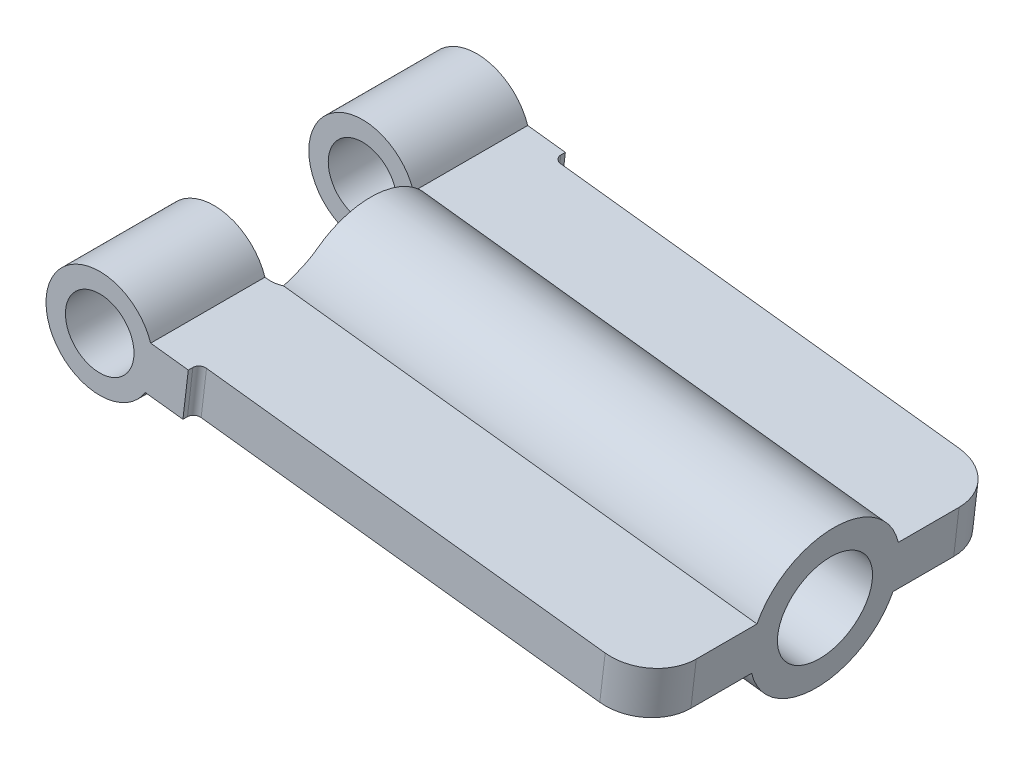
ISO-10303-21;
HEADER;
FILE_DESCRIPTION(('STEP AP214'),'2;1');
FILE_NAME('part.step','',(''),(''),'','','');
FILE_SCHEMA(('AUTOMOTIVE_DESIGN { 1 0 10303 214 1 1 1 1 }'));
ENDSEC;
DATA;
#1=APPLICATION_CONTEXT('core data for automotive mechanical design processes');
#2=APPLICATION_PROTOCOL_DEFINITION('international standard','automotive_design',2000,#1);
#3=PRODUCT_CONTEXT('',#1,'mechanical');
#4=PRODUCT('Part','Part','',(#3));
#5=PRODUCT_RELATED_PRODUCT_CATEGORY('part','',(#4));
#6=PRODUCT_DEFINITION_FORMATION('','',#4);
#7=PRODUCT_DEFINITION_CONTEXT('part definition',#1,'design');
#8=PRODUCT_DEFINITION('design','',#6,#7);
#9=PRODUCT_DEFINITION_SHAPE('','',#8);
#10=(LENGTH_UNIT() NAMED_UNIT(*) SI_UNIT(.MILLI.,.METRE.));
#11=(NAMED_UNIT(*) PLANE_ANGLE_UNIT() SI_UNIT($,.RADIAN.));
#12=(NAMED_UNIT(*) SI_UNIT($,.STERADIAN.) SOLID_ANGLE_UNIT());
#13=UNCERTAINTY_MEASURE_WITH_UNIT(LENGTH_MEASURE(1.E-05),#10,'distance_accuracy_value','');
#14=(GEOMETRIC_REPRESENTATION_CONTEXT(3) GLOBAL_UNCERTAINTY_ASSIGNED_CONTEXT((#13)) GLOBAL_UNIT_ASSIGNED_CONTEXT((#10,
#11,#12)) REPRESENTATION_CONTEXT('',''));
#15=CARTESIAN_POINT('',(0.,0.,0.));
#16=DIRECTION('',(0.,0.,1.));
#17=DIRECTION('',(1.,0.,0.));
#18=AXIS2_PLACEMENT_3D('',#15,#16,#17);
#19=CARTESIAN_POINT('',(23.4858565630687,-2.78155379221129,0.));
#20=DIRECTION('',(0.993059474125525,-0.117613268169611,0.));
#21=DIRECTION('',(0.117613268169611,0.993059474125525,0.));
#22=AXIS2_PLACEMENT_3D('',#19,#20,#21);
#23=CYLINDRICAL_SURFACE('',#22,3.25);
#24=CARTESIAN_POINT('',(2.95161572761441,-2.7111740254914,2.25));
#25=CARTESIAN_POINT('',(2.95608626582767,-2.67332087750269,2.28973842390793));
#26=CARTESIAN_POINT('',(2.95834630297442,-2.63422824473732,2.32844830436368));
#27=CARTESIAN_POINT('',(2.95901822293239,-2.55398116454721,2.40356244787179));
#28=CARTESIAN_POINT('',(2.95743719842487,-2.51283065454717,2.43997083331723));
#29=CARTESIAN_POINT('',(2.94793377351575,-2.3884554142713,2.54411581247918));
#30=CARTESIAN_POINT('',(2.93538661532174,-2.30269811205184,2.60844208561217));
#31=CARTESIAN_POINT('',(2.90487472472898,-2.14560740365681,2.71448607889645));
#32=CARTESIAN_POINT('',(2.88866302684828,-2.07515418458704,2.75808726110204));
#33=CARTESIAN_POINT('',(2.8518297221004,-1.93197490144439,2.83945958726462));
#34=CARTESIAN_POINT('',(2.83120387601062,-1.8592467102904,2.87722506631085));
#35=CARTESIAN_POINT('',(2.78578779507672,-1.70964869318461,2.94819146320348));
#36=CARTESIAN_POINT('',(2.76088043498594,-1.63272194879341,2.98119512696013));
#37=CARTESIAN_POINT('',(2.70830746896609,-1.47770864708105,3.04118583915157));
#38=CARTESIAN_POINT('',(2.68064880606524,-1.39962541217537,3.06818750298834));
#39=CARTESIAN_POINT('',(2.65199320383998,-1.32107856784959,3.09232921921325));
#40=B_SPLINE_CURVE_WITH_KNOTS('',3,(#24,#25,#26,#27,#28,#29,#30,#31,#32,#33,#34,#35,#36,#37,#38,
#39),.UNSPECIFIED.,.F.,.F.,(4,2,2,2,2,2,2,4),(0.,0.165012537301252,0.32972060370622,
0.652255157365791,0.905198504533902,1.1583858702371,1.42012481859849,1.68121925188461),.UNSPECIFIED.);
#41=CARTESIAN_POINT('',(2.95161572761441,-2.7111740254914,2.25));
#42=VERTEX_POINT('',#41);
#43=CARTESIAN_POINT('',(2.65199320383998,-1.32107856784959,3.09232921921325));
#44=VERTEX_POINT('',#43);
#45=EDGE_CURVE('E343',#42,#44,#40,.T.);
#46=ORIENTED_EDGE('',*,*,#45,.F.);
#47=CARTESIAN_POINT('',(3.22744329090795,-0.382243121551234,0.));
#48=DIRECTION('',(0.993059474125525,-0.11761326816961,0.));
#49=DIRECTION('',(0.11761326816961,0.993059474125525,0.));
#50=AXIS2_PLACEMENT_3D('',#47,#48,#49);
#51=CIRCLE('',#50,3.25);
#52=CARTESIAN_POINT('',(2.95161572761441,-2.7111740254914,-2.25));
#53=VERTEX_POINT('',#52);
#54=EDGE_CURVE('E372',#42,#53,#51,.T.);
#55=ORIENTED_EDGE('',*,*,#54,.T.);
#56=CARTESIAN_POINT('',(2.65199320383997,-1.32107856784959,-3.09232921921325));
#57=CARTESIAN_POINT('',(2.68029427051749,-1.39865106755448,-3.06848716434356));
#58=CARTESIAN_POINT('',(2.70762134575508,-1.47577020353553,-3.04185588107446));
#59=CARTESIAN_POINT('',(2.75960524426523,-1.62887894399866,-2.98275993400808));
#60=CARTESIAN_POINT('',(2.78425575058856,-1.70486552623473,-2.95028193139521));
#61=CARTESIAN_POINT('',(2.82929073441251,-1.85270974568055,-2.88048586094778));
#62=CARTESIAN_POINT('',(2.84978684806708,-1.92462159756298,-2.84335687468868));
#63=CARTESIAN_POINT('',(2.88650666877768,-2.06624807849748,-2.76340008307072));
#64=CARTESIAN_POINT('',(2.90273410581265,-2.13596457863861,-2.72057730255835));
#65=CARTESIAN_POINT('',(2.93405367834937,-2.29424394094619,-2.61462953125852));
#66=CARTESIAN_POINT('',(2.94717587420765,-2.38182103500025,-2.54935970081785));
#67=CARTESIAN_POINT('',(2.9572460818653,-2.50879621949657,-2.44349486058805));
#68=CARTESIAN_POINT('',(2.95896605628222,-2.55080581651721,-2.40644804664452));
#69=CARTESIAN_POINT('',(2.95843329091296,-2.63270012690286,-2.32996082627924));
#70=CARTESIAN_POINT('',(2.95617288236011,-2.67258058562205,-2.2905159410354));
#71=CARTESIAN_POINT('',(2.95161572761442,-2.7111740254914,-2.25));
#72=B_SPLINE_CURVE_WITH_KNOTS('',3,(#56,#57,#58,#59,#60,#61,#62,#63,#64,#65,#66,#67,#68,#69,#70,
#71),.UNSPECIFIED.,.F.,.F.,(4,2,2,2,2,2,2,4),(0.,0.257854135384343,0.516304176346524,
0.76644864904969,1.01637381339577,1.3450727474232,1.51298087382052,1.68121285283602),.UNSPECIFIED.);
#73=CARTESIAN_POINT('',(2.65199320383998,-1.32107856784959,-3.09232921921325));
#74=VERTEX_POINT('',#73);
#75=EDGE_CURVE('E310',#74,#53,#72,.T.);
#76=ORIENTED_EDGE('',*,*,#75,.F.);
#77=DIRECTION('',(0.993059474125525,-0.117613268169611,0.));
#78=VECTOR('',#77,1.);
#79=CARTESIAN_POINT('',(23.3682432948991,-3.77461326633681,-3.09232921921325));
#80=LINE('',#79,#78);
#81=CARTESIAN_POINT('',(23.368243294899,-3.77461326633681,-3.09232921921325));
#82=VERTEX_POINT('',#81);
#83=EDGE_CURVE('E215',#82,#74,#80,.F.);
#84=ORIENTED_EDGE('',*,*,#83,.F.);
#85=CARTESIAN_POINT('',(23.4858565630687,-2.78155379221129,0.));
#86=DIRECTION('',(0.993059474125525,-0.117613268169611,0.));
#87=DIRECTION('',(0.117613268169611,0.993059474125525,0.));
#88=AXIS2_PLACEMENT_3D('',#85,#86,#87);
#89=CIRCLE('',#88,3.25);
#90=CARTESIAN_POINT('',(23.368243294899,-3.77461326633681,3.09232921921325));
#91=VERTEX_POINT('',#90);
#92=EDGE_CURVE('E230',#91,#82,#89,.T.);
#93=ORIENTED_EDGE('',*,*,#92,.F.);
#94=DIRECTION('',(0.993059474125525,-0.117613268169611,0.));
#95=VECTOR('',#94,1.);
#96=CARTESIAN_POINT('',(23.3682432948991,-3.77461326633681,3.09232921921325));
#97=LINE('',#96,#95);
#98=EDGE_CURVE('E219',#44,#91,#97,.T.);
#99=ORIENTED_EDGE('',*,*,#98,.F.);
#100=EDGE_LOOP('',(#46,#55,#76,#84,#93,#99));
#101=FACE_BOUND('',#100,.T.);
#102=ADVANCED_FACE('F17',(#101),#23,.T.);
#103=CARTESIAN_POINT('',(0.,0.,8.25));
#104=DIRECTION('',(0.,0.,-1.));
#105=DIRECTION('',(-1.,0.,0.));
#106=AXIS2_PLACEMENT_3D('',#103,#104,#105);
#107=CYLINDRICAL_SURFACE('',#106,2.35);
#108=DIRECTION('',(0.,0.,-1.));
#109=VECTOR('',#108,1.);
#110=CARTESIAN_POINT('',(2.22947045944888,0.742941094868762,8.25));
#111=LINE('',#110,#109);
#112=CARTESIAN_POINT('',(2.22947045944888,0.742941094868762,3.25));
#113=VERTEX_POINT('',#112);
#114=CARTESIAN_POINT('',(2.22947045944888,0.742941094868762,8.25));
#115=VERTEX_POINT('',#114);
#116=EDGE_CURVE('E204',#113,#115,#111,.F.);
#117=ORIENTED_EDGE('',*,*,#116,.F.);
#118=CARTESIAN_POINT('',(0.,0.,3.25));
#119=DIRECTION('',(0.,0.,1.));
#120=DIRECTION('',(1.,0.,0.));
#121=AXIS2_PLACEMENT_3D('',#118,#119,#120);
#122=CIRCLE('',#121,2.35);
#123=CARTESIAN_POINT('',(1.99424392310966,-1.24317785338229,3.25));
#124=VERTEX_POINT('',#123);
#125=EDGE_CURVE('E340',#113,#124,#122,.T.);
#126=ORIENTED_EDGE('',*,*,#125,.T.);
#127=DIRECTION('',(0.,0.,-1.));
#128=VECTOR('',#127,1.);
#129=CARTESIAN_POINT('',(1.99424392310966,-1.24317785338229,8.25));
#130=LINE('',#129,#128);
#131=CARTESIAN_POINT('',(1.99424392310966,-1.24317785338229,8.25));
#132=VERTEX_POINT('',#131);
#133=EDGE_CURVE('E216',#132,#124,#130,.T.);
#134=ORIENTED_EDGE('',*,*,#133,.F.);
#135=CARTESIAN_POINT('',(0.,0.,8.25));
#136=DIRECTION('',(0.,0.,1.));
#137=DIRECTION('',(1.,0.,0.));
#138=AXIS2_PLACEMENT_3D('',#135,#136,#137);
#139=CIRCLE('',#138,2.35);
#140=EDGE_CURVE('E223',#115,#132,#139,.T.);
#141=ORIENTED_EDGE('',*,*,#140,.F.);
#142=EDGE_LOOP('',(#117,#126,#134,#141));
#143=FACE_BOUND('',#142,.T.);
#144=ADVANCED_FACE('F418',(#143),#107,.T.);
#145=CARTESIAN_POINT('',(23.8680996846199,0.445889498696669,0.));
#146=DIRECTION('',(-0.993059474125525,0.117613268169611,0.));
#147=DIRECTION('',(-0.117613268169611,-0.993059474125525,0.));
#148=AXIS2_PLACEMENT_3D('',#145,#146,#147);
#149=PLANE('',#148);
#150=CARTESIAN_POINT('',(23.4858565630687,-2.78155379221129,0.));
#151=DIRECTION('',(0.993059474125525,-0.11761326816961,0.));
#152=DIRECTION('',(0.11761326816961,0.993059474125525,0.));
#153=AXIS2_PLACEMENT_3D('',#150,#151,#152);
#154=CIRCLE('',#153,2.067);
#155=CARTESIAN_POINT('',(23.7289631883752,-0.728899859193828,0.));
#156=VERTEX_POINT('',#155);
#157=EDGE_CURVE('E280',#156,#156,#154,.T.);
#158=ORIENTED_EDGE('',*,*,#157,.F.);
#159=EDGE_LOOP('',(#158));
#160=FACE_BOUND('',#159,.T.);
#161=DIRECTION('',(0.,0.,-1.));
#162=VECTOR('',#161,1.);
#163=CARTESIAN_POINT('',(23.368243294899,-3.77461326633681,8.25));
#164=LINE('',#163,#162);
#165=CARTESIAN_POINT('',(23.368243294899,-3.77461326633681,-5.75));
#166=VERTEX_POINT('',#165);
#167=EDGE_CURVE('E193',#82,#166,#164,.T.);
#168=ORIENTED_EDGE('',*,*,#167,.T.);
#169=DIRECTION('',(-0.11761326816961,-0.993059474125525,0.));
#170=VECTOR('',#169,1.);
#171=CARTESIAN_POINT('',(24.5737792936376,6.40424634344981,-5.75));
#172=LINE('',#171,#170);
#173=CARTESIAN_POINT('',(23.6034698312383,-1.78849431808576,-5.75));
#174=VERTEX_POINT('',#173);
#175=EDGE_CURVE('E32',#174,#166,#172,.T.);
#176=ORIENTED_EDGE('',*,*,#175,.F.);
#177=DIRECTION('',(0.,0.,-1.));
#178=VECTOR('',#177,1.);
#179=CARTESIAN_POINT('',(23.6034698312383,-1.78849431808576,8.25));
#180=LINE('',#179,#178);
#181=CARTESIAN_POINT('',(23.6034698312383,-1.78849431808576,-3.09232921921325));
#182=VERTEX_POINT('',#181);
#183=EDGE_CURVE('E194',#182,#174,#180,.T.);
#184=ORIENTED_EDGE('',*,*,#183,.F.);
#185=CARTESIAN_POINT('',(23.6034698312383,-1.78849431808576,3.09232921921325));
#186=VERTEX_POINT('',#185);
#187=EDGE_CURVE('E192',#182,#186,#89,.T.);
#188=ORIENTED_EDGE('',*,*,#187,.T.);
#189=CARTESIAN_POINT('',(23.6034698312383,-1.78849431808576,5.75));
#190=VERTEX_POINT('',#189);
#191=EDGE_CURVE('E182',#190,#186,#180,.T.);
#192=ORIENTED_EDGE('',*,*,#191,.F.);
#193=DIRECTION('',(-0.11761326816961,-0.993059474125525,0.));
#194=VECTOR('',#193,1.);
#195=CARTESIAN_POINT('',(24.5737792936376,6.40424634344981,5.75));
#196=LINE('',#195,#194);
#197=CARTESIAN_POINT('',(23.368243294899,-3.77461326633681,5.75));
#198=VERTEX_POINT('',#197);
#199=EDGE_CURVE('E164',#190,#198,#196,.T.);
#200=ORIENTED_EDGE('',*,*,#199,.T.);
#201=EDGE_CURVE('E196',#198,#91,#164,.T.);
#202=ORIENTED_EDGE('',*,*,#201,.T.);
#203=ORIENTED_EDGE('',*,*,#92,.T.);
#204=EDGE_LOOP('',(#168,#176,#184,#188,#192,#200,#202,#203));
#205=FACE_BOUND('',#204,.T.);
#206=ADVANCED_FACE('F190',(#160,#205),#149,.F.);
#207=CARTESIAN_POINT('',(0.,0.,8.25));
#208=DIRECTION('',(0.,0.,-1.));
#209=DIRECTION('',(-1.,0.,0.));
#210=AXIS2_PLACEMENT_3D('',#207,#208,#209);
#211=CYLINDRICAL_SURFACE('',#210,1.5);
#212=CARTESIAN_POINT('',(0.,0.,3.25));
#213=DIRECTION('',(0.,0.,1.));
#214=DIRECTION('',(1.,0.,0.));
#215=AXIS2_PLACEMENT_3D('',#212,#213,#214);
#216=CIRCLE('',#215,1.5);
#217=CARTESIAN_POINT('',(1.5,0.,3.25));
#218=VERTEX_POINT('',#217);
#219=EDGE_CURVE('E334',#218,#218,#216,.T.);
#220=ORIENTED_EDGE('',*,*,#219,.F.);
#221=EDGE_LOOP('',(#220));
#222=FACE_BOUND('',#221,.T.);
#223=CARTESIAN_POINT('',(0.,0.,8.25));
#224=DIRECTION('',(0.,0.,1.));
#225=DIRECTION('',(1.,0.,0.));
#226=AXIS2_PLACEMENT_3D('',#223,#224,#225);
#227=CIRCLE('',#226,1.5);
#228=CARTESIAN_POINT('',(1.5,0.,8.25));
#229=VERTEX_POINT('',#228);
#230=EDGE_CURVE('E226',#229,#229,#227,.T.);
#231=ORIENTED_EDGE('',*,*,#230,.T.);
#232=EDGE_LOOP('',(#231));
#233=FACE_BOUND('',#232,.T.);
#234=ADVANCED_FACE('F470',(#222,#233),#211,.F.);
#235=CARTESIAN_POINT('',(23.6034698312383,-1.78849431808576,8.25));
#236=DIRECTION('',(-0.11761326816961,-0.993059474125524,0.));
#237=DIRECTION('',(0.993059474125525,-0.11761326816961,0.));
#238=AXIS2_PLACEMENT_3D('',#235,#236,#237);
#239=PLANE('',#238);
#240=CARTESIAN_POINT('',(2.35199708495204,0.7284296207439,-2.25));
#241=DIRECTION('',(-0.11761326816961,-0.993059474125524,0.));
#242=DIRECTION('',(0.993059474125525,-0.11761326816961,0.));
#243=AXIS2_PLACEMENT_3D('',#240,#241,#242);
#244=CIRCLE('',#243,1.);
#245=CARTESIAN_POINT('',(2.8872197401792,0.665040380401457,-3.09232921921325));
#246=VERTEX_POINT('',#245);
#247=CARTESIAN_POINT('',(2.35199708495204,0.728429620743901,-3.25));
#248=VERTEX_POINT('',#247);
#249=EDGE_CURVE('E295',#246,#248,#244,.F.);
#250=ORIENTED_EDGE('',*,*,#249,.F.);
#251=DIRECTION('',(0.993059474125525,-0.117613268169611,0.));
#252=VECTOR('',#251,1.);
#253=CARTESIAN_POINT('',(23.6034698312383,-1.78849431808576,-3.09232921921325));
#254=LINE('',#253,#252);
#255=EDGE_CURVE('E210',#246,#182,#254,.T.);
#256=ORIENTED_EDGE('',*,*,#255,.T.);
#257=ORIENTED_EDGE('',*,*,#183,.T.);
#258=CARTESIAN_POINT('',(21.6173508829872,-1.55326778174654,-5.75000000000001));
#259=DIRECTION('',(-0.11761326816961,-0.993059474125524,0.));
#260=DIRECTION('',(0.993059474125525,-0.11761326816961,0.));
#261=AXIS2_PLACEMENT_3D('',#258,#259,#260);
#262=CIRCLE('',#261,1.99999999999999);
#263=CARTESIAN_POINT('',(21.6173508829872,-1.55326778174654,-7.75));
#264=VERTEX_POINT('',#263);
#265=EDGE_CURVE('E331',#174,#264,#262,.F.);
#266=ORIENTED_EDGE('',*,*,#265,.T.);
#267=DIRECTION('',(-0.993059474125525,0.11761326816961,0.));
#268=VECTOR('',#267,1.);
#269=CARTESIAN_POINT('',(23.6034698312383,-1.78849431808576,-7.75));
#270=LINE('',#269,#268);
#271=CARTESIAN_POINT('',(4.17426121997237,0.512609273652667,-7.75));
#272=VERTEX_POINT('',#271);
#273=EDGE_CURVE('E328',#264,#272,#270,.T.);
#274=ORIENTED_EDGE('',*,*,#273,.T.);
#275=CARTESIAN_POINT('',(4.17426121997238,0.512609273652665,-8.05));
#276=DIRECTION('',(-0.11761326816961,-0.993059474125524,0.));
#277=DIRECTION('',(0.993059474125525,-0.11761326816961,0.));
#278=AXIS2_PLACEMENT_3D('',#275,#276,#277);
#279=CIRCLE('',#278,0.3);
#280=CARTESIAN_POINT('',(3.87634337773472,0.547893254103548,-8.05));
#281=VERTEX_POINT('',#280);
#282=EDGE_CURVE('E326',#281,#272,#279,.F.);
#283=ORIENTED_EDGE('',*,*,#282,.F.);
#284=DIRECTION('',(0.,0.,-1.));
#285=VECTOR('',#284,1.);
#286=CARTESIAN_POINT('',(3.87634337773472,0.547893254103549,8.25));
#287=LINE('',#286,#285);
#288=CARTESIAN_POINT('',(3.87634337773472,0.54789325410355,-8.25));
#289=VERTEX_POINT('',#288);
#290=EDGE_CURVE('E323',#281,#289,#287,.T.);
#291=ORIENTED_EDGE('',*,*,#290,.T.);
#292=DIRECTION('',(-0.993059474125525,0.11761326816961,0.));
#293=VECTOR('',#292,1.);
#294=CARTESIAN_POINT('',(23.6034698312383,-1.78849431808576,-8.25));
#295=LINE('',#294,#293);
#296=CARTESIAN_POINT('',(2.22947045944888,0.742941094868762,-8.25));
#297=VERTEX_POINT('',#296);
#298=EDGE_CURVE('E201',#289,#297,#295,.T.);
#299=ORIENTED_EDGE('',*,*,#298,.T.);
#300=CARTESIAN_POINT('',(2.22947045944888,0.742941094868762,-3.25));
#301=VERTEX_POINT('',#300);
#302=EDGE_CURVE('E208',#297,#301,#111,.F.);
#303=ORIENTED_EDGE('',*,*,#302,.T.);
#304=DIRECTION('',(0.993059474125525,-0.11761326816961,0.));
#305=VECTOR('',#304,1.);
#306=CARTESIAN_POINT('',(23.6034698312383,-1.78849431808576,-3.25));
#307=LINE('',#306,#305);
#308=EDGE_CURVE('E319',#301,#248,#307,.T.);
#309=ORIENTED_EDGE('',*,*,#308,.T.);
#310=EDGE_LOOP('',(#250,#256,#257,#266,#274,#283,#291,#299,#303,#309));
#311=FACE_BOUND('',#310,.T.);
#312=ADVANCED_FACE('F465',(#311),#239,.F.);
#313=CARTESIAN_POINT('',(1.66989378525633,-1.20476335683082,8.25));
#314=DIRECTION('',(0.11761326816961,0.993059474125524,0.));
#315=DIRECTION('',(-0.993059474125525,0.11761326816961,0.));
#316=AXIS2_PLACEMENT_3D('',#313,#314,#315);
#317=PLANE('',#316);
#318=CARTESIAN_POINT('',(2.11677054861282,-1.25768932750715,-2.25));
#319=DIRECTION('',(0.11761326816961,0.993059474125524,0.));
#320=DIRECTION('',(-0.993059474125525,0.11761326816961,0.));
#321=AXIS2_PLACEMENT_3D('',#318,#319,#320);
#322=CIRCLE('',#321,1.);
#323=CARTESIAN_POINT('',(2.11677054861282,-1.25768932750715,-3.25));
#324=VERTEX_POINT('',#323);
#325=EDGE_CURVE('E11',#324,#74,#322,.F.);
#326=ORIENTED_EDGE('',*,*,#325,.F.);
#327=DIRECTION('',(-0.993059474125525,0.11761326816961,0.));
#328=VECTOR('',#327,1.);
#329=CARTESIAN_POINT('',(1.66989378525633,-1.20476335683082,-3.25));
#330=LINE('',#329,#328);
#331=CARTESIAN_POINT('',(1.99424392310966,-1.24317785338229,-3.25));
#332=VERTEX_POINT('',#331);
#333=EDGE_CURVE('E25',#324,#332,#330,.T.);
#334=ORIENTED_EDGE('',*,*,#333,.T.);
#335=CARTESIAN_POINT('',(1.99424392310966,-1.24317785338229,-8.25));
#336=VERTEX_POINT('',#335);
#337=EDGE_CURVE('E213',#332,#336,#130,.T.);
#338=ORIENTED_EDGE('',*,*,#337,.T.);
#339=DIRECTION('',(0.993059474125525,-0.11761326816961,0.));
#340=VECTOR('',#339,1.);
#341=CARTESIAN_POINT('',(1.66989378525633,-1.20476335683082,-8.25));
#342=LINE('',#341,#340);
#343=CARTESIAN_POINT('',(3.6411168413955,-1.4382256941475,-8.25));
#344=VERTEX_POINT('',#343);
#345=EDGE_CURVE('E276',#336,#344,#342,.T.);
#346=ORIENTED_EDGE('',*,*,#345,.T.);
#347=DIRECTION('',(0.,0.,1.));
#348=VECTOR('',#347,1.);
#349=CARTESIAN_POINT('',(3.6411168413955,-1.4382256941475,8.25));
#350=LINE('',#349,#348);
#351=CARTESIAN_POINT('',(3.6411168413955,-1.4382256941475,-8.05));
#352=VERTEX_POINT('',#351);
#353=EDGE_CURVE('E254',#344,#352,#350,.T.);
#354=ORIENTED_EDGE('',*,*,#353,.T.);
#355=CARTESIAN_POINT('',(3.93903468363316,-1.47350967459838,-8.05));
#356=DIRECTION('',(0.11761326816961,0.993059474125524,0.));
#357=DIRECTION('',(-0.993059474125525,0.11761326816961,0.));
#358=AXIS2_PLACEMENT_3D('',#355,#356,#357);
#359=CIRCLE('',#358,0.3);
#360=CARTESIAN_POINT('',(3.93903468363315,-1.47350967459838,-7.75));
#361=VERTEX_POINT('',#360);
#362=EDGE_CURVE('E252',#361,#352,#359,.F.);
#363=ORIENTED_EDGE('',*,*,#362,.F.);
#364=DIRECTION('',(0.993059474125525,-0.11761326816961,0.));
#365=VECTOR('',#364,1.);
#366=CARTESIAN_POINT('',(1.66989378525633,-1.20476335683082,-7.75));
#367=LINE('',#366,#365);
#368=CARTESIAN_POINT('',(21.382124346648,-3.53938672999759,-7.75));
#369=VERTEX_POINT('',#368);
#370=EDGE_CURVE('E249',#361,#369,#367,.T.);
#371=ORIENTED_EDGE('',*,*,#370,.T.);
#372=CARTESIAN_POINT('',(21.382124346648,-3.53938672999759,-5.75000000000001));
#373=DIRECTION('',(0.11761326816961,0.993059474125524,0.));
#374=DIRECTION('',(-0.993059474125525,0.11761326816961,0.));
#375=AXIS2_PLACEMENT_3D('',#372,#373,#374);
#376=CIRCLE('',#375,1.99999999999999);
#377=EDGE_CURVE('E247',#369,#166,#376,.F.);
#378=ORIENTED_EDGE('',*,*,#377,.T.);
#379=ORIENTED_EDGE('',*,*,#167,.F.);
#380=ORIENTED_EDGE('',*,*,#83,.T.);
#381=EDGE_LOOP('',(#326,#334,#338,#346,#354,#363,#371,#378,#379,#380));
#382=FACE_BOUND('',#381,.T.);
#383=ADVANCED_FACE('F260',(#382),#317,.F.);
#384=CARTESIAN_POINT('',(3.5032708542015,1.94668778238893,-2.25));
#385=CARTESIAN_POINT('',(3.49877544557172,1.90883757993474,-2.28973842390793));
#386=CARTESIAN_POINT('',(3.49184115493804,1.87029854364892,-2.32844830436368));
#387=CARTESIAN_POINT('',(3.47374925404516,1.79211460362573,-2.40356244787179));
#388=CARTESIAN_POINT('',(3.46259946000134,1.75247187157385,-2.43997083331723));
#389=CARTESIAN_POINT('',(3.42430565210722,1.63375750952926,-2.54411581247919));
#390=CARTESIAN_POINT('',(3.39207323445165,1.55330368852129,-2.60844208561217));
#391=CARTESIAN_POINT('',(3.32571004096663,1.40768640698484,-2.71448607889645));
#392=CARTESIAN_POINT('',(3.29348940699441,1.34296928427457,-2.75808726110204));
#393=CARTESIAN_POINT('',(3.22422931073426,1.21235520185645,-2.83945958726462));
#394=CARTESIAN_POINT('',(3.18718522963178,1.14645716417153,-2.87722506631085));
#395=CARTESIAN_POINT('',(3.10808042886696,1.01160681146402,-2.94819146320348));
#396=CARTESIAN_POINT('',(3.06589252851457,0.94262651244193,-2.98119512696013));
#397=CARTESIAN_POINT('',(2.97856386567104,0.804182498090098,-3.04118583915157));
#398=CARTESIAN_POINT('',(2.93343063022007,0.734720391409353,-3.06818750298834));
#399=CARTESIAN_POINT('',(2.8872197401792,0.665040380401454,-3.09232921921325));
#400=B_SPLINE_CURVE_WITH_KNOTS('',3,(#384,#385,#386,#387,#388,#389,#390,#391,#392,#393,#394,
#395,#396,#397,#398,#399),.UNSPECIFIED.,.F.,.F.,(4,2,2,2,2,2,2,4),(0.,0.165012537301252,
0.329720603706221,0.652255157365792,0.905198504533902,1.1583858702371,1.42012481859849,
1.68121925188461),.UNSPECIFIED.);
#401=CARTESIAN_POINT('',(3.5032708542015,1.94668778238893,-2.25));
#402=VERTEX_POINT('',#401);
#403=EDGE_CURVE('E283',#402,#246,#400,.T.);
#404=ORIENTED_EDGE('',*,*,#403,.F.);
#405=CARTESIAN_POINT('',(3.22744329090795,-0.382243121551234,0.));
#406=DIRECTION('',(0.993059474125525,-0.11761326816961,0.));
#407=DIRECTION('',(0.11761326816961,0.993059474125525,0.));
#408=AXIS2_PLACEMENT_3D('',#405,#406,#407);
#409=CIRCLE('',#408,3.25);
#410=CARTESIAN_POINT('',(3.50327085420149,1.94668778238893,2.25));
#411=VERTEX_POINT('',#410);
#412=EDGE_CURVE('E375',#402,#411,#409,.T.);
#413=ORIENTED_EDGE('',*,*,#412,.T.);
#414=CARTESIAN_POINT('',(2.88721974017919,0.665040380401458,3.09232921921325));
#415=CARTESIAN_POINT('',(2.93285830216893,0.73385582013019,3.06848716434356));
#416=CARTESIAN_POINT('',(2.97744391591509,0.802457957286287,3.04185588107446));
#417=CARTESIAN_POINT('',(3.06375491428318,0.939187704127353,2.98275993400808));
#418=CARTESIAN_POINT('',(3.10547345074073,1.00731385078012,2.95028193139521));
#419=CARTESIAN_POINT('',(3.18379802123125,1.1405479479514,2.88048586094778));
#420=CARTESIAN_POINT('',(3.22052526713793,1.20568253572327,2.84335687468868));
#421=CARTESIAN_POINT('',(3.28931229379656,1.33481328457254,2.76340008307072));
#422=CARTESIAN_POINT('',(3.3213761384098,1.39881039367342,2.72057730255835));
#423=CARTESIAN_POINT('',(3.38880233105387,1.5453947744986,2.61462953125852));
#424=CARTESIAN_POINT('',(3.42201896986422,1.62748371610002,2.54935970081785));
#425=CARTESIAN_POINT('',(3.46147121124589,1.74859369591219,2.44349486058805));
#426=CARTESIAN_POINT('',(3.47295678856638,1.78903928983101,2.40644804664452));
#427=CARTESIAN_POINT('',(3.49156877722253,1.86879238250297,2.32996082627924));
#428=CARTESIAN_POINT('',(3.49868673809431,1.90809753569574,2.2905159410354));
#429=CARTESIAN_POINT('',(3.5032708542015,1.94668778238893,2.25));
#430=B_SPLINE_CURVE_WITH_KNOTS('',3,(#414,#415,#416,#417,#418,#419,#420,#421,#422,#423,#424,
#425,#426,#427,#428,#429),.UNSPECIFIED.,.F.,.F.,(4,2,2,2,2,2,2,4),(0.,0.257854135384343,
0.516304176346524,0.76644864904969,1.01637381339577,1.3450727474232,1.51298087382052,
1.68121285283602),.UNSPECIFIED.);
#431=CARTESIAN_POINT('',(2.8872197401792,0.665040380401457,3.09232921921325));
#432=VERTEX_POINT('',#431);
#433=EDGE_CURVE('E356',#432,#411,#430,.T.);
#434=ORIENTED_EDGE('',*,*,#433,.F.);
#435=DIRECTION('',(0.993059474125525,-0.117613268169611,0.));
#436=VECTOR('',#435,1.);
#437=CARTESIAN_POINT('',(23.6034698312383,-1.78849431808576,3.09232921921325));
#438=LINE('',#437,#436);
#439=EDGE_CURVE('E207',#186,#432,#438,.F.);
#440=ORIENTED_EDGE('',*,*,#439,.F.);
#441=ORIENTED_EDGE('',*,*,#187,.F.);
#442=ORIENTED_EDGE('',*,*,#255,.F.);
#443=EDGE_LOOP('',(#404,#413,#434,#440,#441,#442));
#444=FACE_BOUND('',#443,.T.);
#445=ADVANCED_FACE('F428',(#444),#23,.T.);
#446=ORIENTED_EDGE('',*,*,#337,.F.);
#447=CARTESIAN_POINT('',(0.,0.,-3.25));
#448=DIRECTION('',(0.,0.,-1.));
#449=DIRECTION('',(-1.,0.,0.));
#450=AXIS2_PLACEMENT_3D('',#447,#448,#449);
#451=CIRCLE('',#450,2.35);
#452=EDGE_CURVE('E269',#332,#301,#451,.T.);
#453=ORIENTED_EDGE('',*,*,#452,.T.);
#454=ORIENTED_EDGE('',*,*,#302,.F.);
#455=CARTESIAN_POINT('',(0.,0.,-8.25));
#456=DIRECTION('',(0.,0.,1.));
#457=DIRECTION('',(1.,0.,0.));
#458=AXIS2_PLACEMENT_3D('',#455,#456,#457);
#459=CIRCLE('',#458,2.35);
#460=EDGE_CURVE('E222',#297,#336,#459,.T.);
#461=ORIENTED_EDGE('',*,*,#460,.T.);
#462=EDGE_LOOP('',(#446,#453,#454,#461));
#463=FACE_BOUND('',#462,.T.);
#464=ADVANCED_FACE('F267',(#463),#107,.T.);
#465=CARTESIAN_POINT('',(0.,0.,-3.25));
#466=DIRECTION('',(0.,0.,-1.));
#467=DIRECTION('',(-1.,0.,0.));
#468=AXIS2_PLACEMENT_3D('',#465,#466,#467);
#469=CIRCLE('',#468,1.5);
#470=CARTESIAN_POINT('',(-1.5,0.,-3.25));
#471=VERTEX_POINT('',#470);
#472=EDGE_CURVE('E316',#471,#471,#469,.T.);
#473=ORIENTED_EDGE('',*,*,#472,.F.);
#474=EDGE_LOOP('',(#473));
#475=FACE_BOUND('',#474,.T.);
#476=CARTESIAN_POINT('',(0.,0.,-8.25));
#477=DIRECTION('',(0.,0.,1.));
#478=DIRECTION('',(1.,0.,0.));
#479=AXIS2_PLACEMENT_3D('',#476,#477,#478);
#480=CIRCLE('',#479,1.5);
#481=CARTESIAN_POINT('',(1.5,0.,-8.25));
#482=VERTEX_POINT('',#481);
#483=EDGE_CURVE('E227',#482,#482,#480,.T.);
#484=ORIENTED_EDGE('',*,*,#483,.F.);
#485=EDGE_LOOP('',(#484));
#486=FACE_BOUND('',#485,.T.);
#487=ADVANCED_FACE('F464',(#475,#486),#211,.F.);
#488=CARTESIAN_POINT('',(0.,0.,8.25));
#489=DIRECTION('',(0.,0.,1.));
#490=DIRECTION('',(1.,0.,0.));
#491=AXIS2_PLACEMENT_3D('',#488,#489,#490);
#492=PLANE('',#491);
#493=DIRECTION('',(-0.11761326816961,-0.993059474125525,0.));
#494=VECTOR('',#493,1.);
#495=CARTESIAN_POINT('',(4.84665284013397,8.74063391563913,8.25));
#496=LINE('',#495,#494);
#497=CARTESIAN_POINT('',(3.87634337773469,0.547893254103552,8.25));
#498=VERTEX_POINT('',#497);
#499=CARTESIAN_POINT('',(3.64111684139547,-1.4382256941475,8.25));
#500=VERTEX_POINT('',#499);
#501=EDGE_CURVE('E380',#498,#500,#496,.T.);
#502=ORIENTED_EDGE('',*,*,#501,.F.);
#503=DIRECTION('',(-0.993059474125525,0.11761326816961,0.));
#504=VECTOR('',#503,1.);
#505=CARTESIAN_POINT('',(23.6034698312383,-1.78849431808576,8.25));
#506=LINE('',#505,#504);
#507=EDGE_CURVE('E199',#498,#115,#506,.T.);
#508=ORIENTED_EDGE('',*,*,#507,.T.);
#509=ORIENTED_EDGE('',*,*,#140,.T.);
#510=DIRECTION('',(0.993059474125525,-0.11761326816961,0.));
#511=VECTOR('',#510,1.);
#512=CARTESIAN_POINT('',(1.66989378525633,-1.20476335683082,8.25));
#513=LINE('',#512,#511);
#514=EDGE_CURVE('E281',#132,#500,#513,.T.);
#515=ORIENTED_EDGE('',*,*,#514,.T.);
#516=EDGE_LOOP('',(#502,#508,#509,#515));
#517=FACE_BOUND('',#516,.T.);
#518=ORIENTED_EDGE('',*,*,#230,.F.);
#519=EDGE_LOOP('',(#518));
#520=FACE_BOUND('',#519,.T.);
#521=ADVANCED_FACE('F421',(#517,#520),#492,.T.);
#522=CARTESIAN_POINT('',(0.,0.,-8.25));
#523=DIRECTION('',(0.,0.,1.));
#524=DIRECTION('',(1.,0.,0.));
#525=AXIS2_PLACEMENT_3D('',#522,#523,#524);
#526=PLANE('',#525);
#527=ORIENTED_EDGE('',*,*,#298,.F.);
#528=DIRECTION('',(-0.11761326816961,-0.993059474125525,0.));
#529=VECTOR('',#528,1.);
#530=CARTESIAN_POINT('',(4.84665284013401,8.74063391563913,-8.25));
#531=LINE('',#530,#529);
#532=EDGE_CURVE('E279',#289,#344,#531,.T.);
#533=ORIENTED_EDGE('',*,*,#532,.T.);
#534=ORIENTED_EDGE('',*,*,#345,.F.);
#535=ORIENTED_EDGE('',*,*,#460,.F.);
#536=EDGE_LOOP('',(#527,#533,#534,#535));
#537=FACE_BOUND('',#536,.T.);
#538=ORIENTED_EDGE('',*,*,#483,.T.);
#539=EDGE_LOOP('',(#538));
#540=FACE_BOUND('',#539,.T.);
#541=ADVANCED_FACE('F277',(#537,#540),#526,.F.);
#542=ORIENTED_EDGE('',*,*,#133,.T.);
#543=DIRECTION('',(0.993059474125525,-0.11761326816961,0.));
#544=VECTOR('',#543,1.);
#545=CARTESIAN_POINT('',(1.66989378525633,-1.20476335683082,3.25));
#546=LINE('',#545,#544);
#547=CARTESIAN_POINT('',(2.11677054861282,-1.25768932750715,3.25));
#548=VERTEX_POINT('',#547);
#549=EDGE_CURVE('E337',#124,#548,#546,.T.);
#550=ORIENTED_EDGE('',*,*,#549,.T.);
#551=CARTESIAN_POINT('',(2.11677054861282,-1.25768932750715,2.25));
#552=DIRECTION('',(0.11761326816961,0.993059474125524,0.));
#553=DIRECTION('',(-0.993059474125525,0.11761326816961,0.));
#554=AXIS2_PLACEMENT_3D('',#551,#552,#553);
#555=CIRCLE('',#554,1.);
#556=EDGE_CURVE('E349',#44,#548,#555,.F.);
#557=ORIENTED_EDGE('',*,*,#556,.F.);
#558=ORIENTED_EDGE('',*,*,#98,.T.);
#559=ORIENTED_EDGE('',*,*,#201,.F.);
#560=CARTESIAN_POINT('',(21.382124346648,-3.53938672999759,5.75000000000001));
#561=DIRECTION('',(0.11761326816961,0.993059474125524,0.));
#562=DIRECTION('',(-0.993059474125525,0.11761326816961,0.));
#563=AXIS2_PLACEMENT_3D('',#560,#561,#562);
#564=CIRCLE('',#563,1.99999999999999);
#565=CARTESIAN_POINT('',(21.382124346648,-3.53938672999759,7.75));
#566=VERTEX_POINT('',#565);
#567=EDGE_CURVE('E171',#198,#566,#564,.F.);
#568=ORIENTED_EDGE('',*,*,#567,.T.);
#569=DIRECTION('',(-0.993059474125525,0.11761326816961,0.));
#570=VECTOR('',#569,1.);
#571=CARTESIAN_POINT('',(1.66989378525633,-1.20476335683082,7.75));
#572=LINE('',#571,#570);
#573=CARTESIAN_POINT('',(3.93903468363315,-1.47350967459838,7.75));
#574=VERTEX_POINT('',#573);
#575=EDGE_CURVE('E364',#566,#574,#572,.T.);
#576=ORIENTED_EDGE('',*,*,#575,.T.);
#577=CARTESIAN_POINT('',(3.93903468363312,-1.47350967459838,8.05));
#578=DIRECTION('',(0.11761326816961,0.993059474125524,0.));
#579=DIRECTION('',(-0.993059474125525,0.11761326816961,0.));
#580=AXIS2_PLACEMENT_3D('',#577,#578,#579);
#581=CIRCLE('',#580,0.300000000000001);
#582=CARTESIAN_POINT('',(3.64111684139547,-1.4382256941475,8.05));
#583=VERTEX_POINT('',#582);
#584=EDGE_CURVE('E367',#583,#574,#581,.F.);
#585=ORIENTED_EDGE('',*,*,#584,.F.);
#586=DIRECTION('',(0.,0.,1.));
#587=VECTOR('',#586,1.);
#588=CARTESIAN_POINT('',(3.64111684139547,-1.4382256941475,8.25));
#589=LINE('',#588,#587);
#590=EDGE_CURVE('E369',#583,#500,#589,.T.);
#591=ORIENTED_EDGE('',*,*,#590,.T.);
#592=ORIENTED_EDGE('',*,*,#514,.F.);
#593=EDGE_LOOP('',(#542,#550,#557,#558,#559,#568,#576,#585,#591,#592));
#594=FACE_BOUND('',#593,.T.);
#595=ADVANCED_FACE('F412',(#594),#317,.F.);
#596=CARTESIAN_POINT('',(2.35199708495204,0.7284296207439,2.25));
#597=DIRECTION('',(-0.11761326816961,-0.993059474125524,0.));
#598=DIRECTION('',(0.993059474125525,-0.11761326816961,0.));
#599=AXIS2_PLACEMENT_3D('',#596,#597,#598);
#600=CIRCLE('',#599,1.);
#601=CARTESIAN_POINT('',(2.35199708495204,0.7284296207439,3.25));
#602=VERTEX_POINT('',#601);
#603=EDGE_CURVE('E186',#602,#432,#600,.F.);
#604=ORIENTED_EDGE('',*,*,#603,.F.);
#605=DIRECTION('',(-0.993059474125525,0.11761326816961,0.));
#606=VECTOR('',#605,1.);
#607=CARTESIAN_POINT('',(23.6034698312383,-1.78849431808576,3.25));
#608=LINE('',#607,#606);
#609=EDGE_CURVE('E244',#602,#113,#608,.T.);
#610=ORIENTED_EDGE('',*,*,#609,.T.);
#611=ORIENTED_EDGE('',*,*,#116,.T.);
#612=ORIENTED_EDGE('',*,*,#507,.F.);
#613=DIRECTION('',(0.,0.,-1.));
#614=VECTOR('',#613,1.);
#615=CARTESIAN_POINT('',(3.87634337773468,0.547893254103553,8.25));
#616=LINE('',#615,#614);
#617=CARTESIAN_POINT('',(3.87634337773468,0.547893254103553,8.05));
#618=VERTEX_POINT('',#617);
#619=EDGE_CURVE('E236',#498,#618,#616,.T.);
#620=ORIENTED_EDGE('',*,*,#619,.T.);
#621=CARTESIAN_POINT('',(4.17426121997234,0.512609273652671,8.05));
#622=DIRECTION('',(-0.11761326816961,-0.993059474125524,0.));
#623=DIRECTION('',(0.993059474125525,-0.11761326816961,0.));
#624=AXIS2_PLACEMENT_3D('',#621,#622,#623);
#625=CIRCLE('',#624,0.300000000000001);
#626=CARTESIAN_POINT('',(4.17426121997237,0.512609273652667,7.75));
#627=VERTEX_POINT('',#626);
#628=EDGE_CURVE('E239',#627,#618,#625,.F.);
#629=ORIENTED_EDGE('',*,*,#628,.F.);
#630=DIRECTION('',(0.993059474125525,-0.11761326816961,0.));
#631=VECTOR('',#630,1.);
#632=CARTESIAN_POINT('',(23.6034698312383,-1.78849431808576,7.75));
#633=LINE('',#632,#631);
#634=CARTESIAN_POINT('',(21.6173508829872,-1.55326778174654,7.75));
#635=VERTEX_POINT('',#634);
#636=EDGE_CURVE('E185',#627,#635,#633,.T.);
#637=ORIENTED_EDGE('',*,*,#636,.T.);
#638=CARTESIAN_POINT('',(21.6173508829872,-1.55326778174654,5.75000000000001));
#639=DIRECTION('',(-0.11761326816961,-0.993059474125524,0.));
#640=DIRECTION('',(0.993059474125525,-0.11761326816961,0.));
#641=AXIS2_PLACEMENT_3D('',#638,#639,#640);
#642=CIRCLE('',#641,1.99999999999999);
#643=EDGE_CURVE('E168',#635,#190,#642,.F.);
#644=ORIENTED_EDGE('',*,*,#643,.T.);
#645=ORIENTED_EDGE('',*,*,#191,.T.);
#646=ORIENTED_EDGE('',*,*,#439,.T.);
#647=EDGE_LOOP('',(#604,#610,#611,#612,#620,#629,#637,#644,#645,#646));
#648=FACE_BOUND('',#647,.T.);
#649=ADVANCED_FACE('F180',(#648),#239,.F.);
#650=CARTESIAN_POINT('',(23.4858565630687,-2.78155379221129,0.));
#651=DIRECTION('',(0.993059474125525,-0.11761326816961,0.));
#652=DIRECTION('',(0.11761326816961,0.993059474125525,0.));
#653=AXIS2_PLACEMENT_3D('',#650,#651,#652);
#654=CYLINDRICAL_SURFACE('',#653,2.067);
#655=ORIENTED_EDGE('',*,*,#157,.T.);
#656=EDGE_LOOP('',(#655));
#657=FACE_BOUND('',#656,.T.);
#658=CARTESIAN_POINT('',(3.22744329090795,-0.382243121551239,0.));
#659=DIRECTION('',(0.993059474125525,-0.11761326816961,0.));
#660=DIRECTION('',(0.11761326816961,0.993059474125525,0.));
#661=AXIS2_PLACEMENT_3D('',#658,#659,#660);
#662=CIRCLE('',#661,2.067);
#663=CARTESIAN_POINT('',(3.47054991621454,1.67041081146622,0.));
#664=VERTEX_POINT('',#663);
#665=EDGE_CURVE('E377',#664,#664,#662,.T.);
#666=ORIENTED_EDGE('',*,*,#665,.F.);
#667=EDGE_LOOP('',(#666));
#668=FACE_BOUND('',#667,.T.);
#669=ADVANCED_FACE('F479',(#657,#668),#654,.F.);
#670=CARTESIAN_POINT('',(-1.39472595474491,9.47983330608513,-3.25));
#671=DIRECTION('',(0.,0.,-1.));
#672=DIRECTION('',(-1.,0.,0.));
#673=AXIS2_PLACEMENT_3D('',#670,#671,#672);
#674=PLANE('',#673);
#675=ORIENTED_EDGE('',*,*,#472,.T.);
#676=EDGE_LOOP('',(#675));
#677=FACE_BOUND('',#676,.T.);
#678=ORIENTED_EDGE('',*,*,#452,.F.);
#679=ORIENTED_EDGE('',*,*,#333,.F.);
#680=DIRECTION('',(-0.11761326816961,-0.993059474125525,0.));
#681=VECTOR('',#680,1.);
#682=CARTESIAN_POINT('',(3.32230654735133,8.92117028227948,-3.25));
#683=LINE('',#682,#681);
#684=EDGE_CURVE('E400',#248,#324,#683,.T.);
#685=ORIENTED_EDGE('',*,*,#684,.F.);
#686=ORIENTED_EDGE('',*,*,#308,.F.);
#687=EDGE_LOOP('',(#678,#679,#685,#686));
#688=FACE_BOUND('',#687,.T.);
#689=ADVANCED_FACE('F307',(#677,#688),#674,.F.);
#690=CARTESIAN_POINT('',(4.31536602147685,8.80355701410987,-2.25));
#691=DIRECTION('',(0.993059474125525,-0.11761326816961,0.));
#692=DIRECTION('',(0.11761326816961,0.993059474125525,0.));
#693=AXIS2_PLACEMENT_3D('',#690,#691,#692);
#694=PLANE('',#693);
#695=ORIENTED_EDGE('',*,*,#665,.T.);
#696=EDGE_LOOP('',(#695));
#697=FACE_BOUND('',#696,.T.);
#698=DIRECTION('',(-0.11761326816961,-0.993059474125525,0.));
#699=VECTOR('',#698,1.);
#700=CARTESIAN_POINT('',(4.31536602147685,8.80355701410987,2.25));
#701=LINE('',#700,#699);
#702=EDGE_CURVE('E405',#411,#42,#701,.T.);
#703=ORIENTED_EDGE('',*,*,#702,.F.);
#704=ORIENTED_EDGE('',*,*,#412,.F.);
#705=DIRECTION('',(-0.11761326816961,-0.993059474125525,0.));
#706=VECTOR('',#705,1.);
#707=CARTESIAN_POINT('',(4.31536602147685,8.80355701410987,-2.25));
#708=LINE('',#707,#706);
#709=EDGE_CURVE('E402',#402,#53,#708,.T.);
#710=ORIENTED_EDGE('',*,*,#709,.T.);
#711=ORIENTED_EDGE('',*,*,#54,.F.);
#712=EDGE_LOOP('',(#703,#704,#710,#711));
#713=FACE_BOUND('',#712,.T.);
#714=ADVANCED_FACE('F305',(#697,#713),#694,.F.);
#715=CARTESIAN_POINT('',(3.32230654735133,8.92117028227948,2.25));
#716=DIRECTION('',(-0.11761326816961,-0.993059474125525,0.));
#717=DIRECTION('',(0.993059474125525,-0.11761326816961,0.));
#718=AXIS2_PLACEMENT_3D('',#715,#716,#717);
#719=CYLINDRICAL_SURFACE('',#718,1.);
#720=ORIENTED_EDGE('',*,*,#45,.T.);
#721=ORIENTED_EDGE('',*,*,#556,.T.);
#722=DIRECTION('',(-0.11761326816961,-0.993059474125525,0.));
#723=VECTOR('',#722,1.);
#724=CARTESIAN_POINT('',(3.32230654735133,8.92117028227948,3.25));
#725=LINE('',#724,#723);
#726=EDGE_CURVE('E40',#602,#548,#725,.T.);
#727=ORIENTED_EDGE('',*,*,#726,.F.);
#728=ORIENTED_EDGE('',*,*,#603,.T.);
#729=ORIENTED_EDGE('',*,*,#433,.T.);
#730=ORIENTED_EDGE('',*,*,#702,.T.);
#731=EDGE_LOOP('',(#720,#721,#727,#728,#729,#730));
#732=FACE_BOUND('',#731,.T.);
#733=ADVANCED_FACE('F351',(#732),#719,.F.);
#734=CARTESIAN_POINT('',(3.32230654735133,8.92117028227948,3.25));
#735=DIRECTION('',(0.,0.,1.));
#736=DIRECTION('',(1.,0.,0.));
#737=AXIS2_PLACEMENT_3D('',#734,#735,#736);
#738=PLANE('',#737);
#739=ORIENTED_EDGE('',*,*,#219,.T.);
#740=EDGE_LOOP('',(#739));
#741=FACE_BOUND('',#740,.T.);
#742=ORIENTED_EDGE('',*,*,#125,.F.);
#743=ORIENTED_EDGE('',*,*,#609,.F.);
#744=ORIENTED_EDGE('',*,*,#726,.T.);
#745=ORIENTED_EDGE('',*,*,#549,.F.);
#746=EDGE_LOOP('',(#742,#743,#744,#745));
#747=FACE_BOUND('',#746,.T.);
#748=ADVANCED_FACE('F303',(#741,#747),#738,.F.);
#749=CARTESIAN_POINT('',(3.32230654735133,8.92117028227948,-2.25));
#750=DIRECTION('',(-0.11761326816961,-0.993059474125525,0.));
#751=DIRECTION('',(0.993059474125525,-0.11761326816961,0.));
#752=AXIS2_PLACEMENT_3D('',#749,#750,#751);
#753=CYLINDRICAL_SURFACE('',#752,1.);
#754=ORIENTED_EDGE('',*,*,#403,.T.);
#755=ORIENTED_EDGE('',*,*,#249,.T.);
#756=ORIENTED_EDGE('',*,*,#684,.T.);
#757=ORIENTED_EDGE('',*,*,#325,.T.);
#758=ORIENTED_EDGE('',*,*,#75,.T.);
#759=ORIENTED_EDGE('',*,*,#709,.F.);
#760=EDGE_LOOP('',(#754,#755,#756,#757,#758,#759));
#761=FACE_BOUND('',#760,.T.);
#762=ADVANCED_FACE('F297',(#761),#753,.F.);
#763=CARTESIAN_POINT('',(4.84665284013397,8.74063391563913,8.25));
#764=DIRECTION('',(-0.993059474125525,0.11761326816961,0.));
#765=DIRECTION('',(-0.11761326816961,-0.993059474125525,0.));
#766=AXIS2_PLACEMENT_3D('',#763,#764,#765);
#767=PLANE('',#766);
#768=DIRECTION('',(-0.11761326816961,-0.993059474125525,0.));
#769=VECTOR('',#768,1.);
#770=CARTESIAN_POINT('',(4.84665284013397,8.74063391563913,8.05));
#771=LINE('',#770,#769);
#772=EDGE_CURVE('E382',#618,#583,#771,.T.);
#773=ORIENTED_EDGE('',*,*,#772,.F.);
#774=ORIENTED_EDGE('',*,*,#619,.F.);
#775=ORIENTED_EDGE('',*,*,#501,.T.);
#776=ORIENTED_EDGE('',*,*,#590,.F.);
#777=EDGE_LOOP('',(#773,#774,#775,#776));
#778=FACE_BOUND('',#777,.T.);
#779=ADVANCED_FACE('F302',(#778),#767,.F.);
#780=CARTESIAN_POINT('',(5.14457068237163,8.70534993518825,8.05));
#781=DIRECTION('',(-0.11761326816961,-0.993059474125525,0.));
#782=DIRECTION('',(0.993059474125525,-0.11761326816961,0.));
#783=AXIS2_PLACEMENT_3D('',#780,#781,#782);
#784=CYLINDRICAL_SURFACE('',#783,0.300000000000001);
#785=ORIENTED_EDGE('',*,*,#584,.T.);
#786=DIRECTION('',(-0.11761326816961,-0.993059474125525,0.));
#787=VECTOR('',#786,1.);
#788=CARTESIAN_POINT('',(5.14457068237166,8.70534993518824,7.75));
#789=LINE('',#788,#787);
#790=EDGE_CURVE('E385',#627,#574,#789,.T.);
#791=ORIENTED_EDGE('',*,*,#790,.F.);
#792=ORIENTED_EDGE('',*,*,#628,.T.);
#793=ORIENTED_EDGE('',*,*,#772,.T.);
#794=EDGE_LOOP('',(#785,#791,#792,#793));
#795=FACE_BOUND('',#794,.T.);
#796=ADVANCED_FACE('F444',(#795),#784,.F.);
#797=CARTESIAN_POINT('',(5.14457068237166,8.70534993518824,7.75));
#798=DIRECTION('',(0.,0.,-1.));
#799=DIRECTION('',(-1.,0.,0.));
#800=AXIS2_PLACEMENT_3D('',#797,#798,#799);
#801=PLANE('',#800);
#802=DIRECTION('',(-0.11761326816961,-0.993059474125525,0.));
#803=VECTOR('',#802,1.);
#804=CARTESIAN_POINT('',(22.5876603453865,6.63947287978903,7.75));
#805=LINE('',#804,#803);
#806=EDGE_CURVE('E175',#635,#566,#805,.T.);
#807=ORIENTED_EDGE('',*,*,#806,.F.);
#808=ORIENTED_EDGE('',*,*,#636,.F.);
#809=ORIENTED_EDGE('',*,*,#790,.T.);
#810=ORIENTED_EDGE('',*,*,#575,.F.);
#811=EDGE_LOOP('',(#807,#808,#809,#810));
#812=FACE_BOUND('',#811,.T.);
#813=ADVANCED_FACE('F441',(#812),#801,.F.);
#814=CARTESIAN_POINT('',(22.5876603453865,6.63947287978903,5.75000000000001));
#815=DIRECTION('',(-0.11761326816961,-0.993059474125525,0.));
#816=DIRECTION('',(0.993059474125525,-0.11761326816961,0.));
#817=AXIS2_PLACEMENT_3D('',#814,#815,#816);
#818=CYLINDRICAL_SURFACE('',#817,1.99999999999999);
#819=ORIENTED_EDGE('',*,*,#199,.F.);
#820=ORIENTED_EDGE('',*,*,#643,.F.);
#821=ORIENTED_EDGE('',*,*,#806,.T.);
#822=ORIENTED_EDGE('',*,*,#567,.F.);
#823=EDGE_LOOP('',(#819,#820,#821,#822));
#824=FACE_BOUND('',#823,.T.);
#825=ADVANCED_FACE('F166',(#824),#818,.T.);
#826=CARTESIAN_POINT('',(4.84665284013401,8.74063391563913,-8.05));
#827=DIRECTION('',(-0.993059474125525,0.11761326816961,0.));
#828=DIRECTION('',(-0.11761326816961,-0.993059474125525,0.));
#829=AXIS2_PLACEMENT_3D('',#826,#827,#828);
#830=PLANE('',#829);
#831=DIRECTION('',(-0.11761326816961,-0.993059474125525,0.));
#832=VECTOR('',#831,1.);
#833=CARTESIAN_POINT('',(4.84665284013401,8.74063391563913,-8.05));
#834=LINE('',#833,#832);
#835=EDGE_CURVE('E396',#281,#352,#834,.T.);
#836=ORIENTED_EDGE('',*,*,#835,.T.);
#837=ORIENTED_EDGE('',*,*,#353,.F.);
#838=ORIENTED_EDGE('',*,*,#532,.F.);
#839=ORIENTED_EDGE('',*,*,#290,.F.);
#840=EDGE_LOOP('',(#836,#837,#838,#839));
#841=FACE_BOUND('',#840,.T.);
#842=ADVANCED_FACE('F510',(#841),#830,.F.);
#843=CARTESIAN_POINT('',(5.14457068237167,8.70534993518824,-8.05));
#844=DIRECTION('',(-0.11761326816961,-0.993059474125525,0.));
#845=DIRECTION('',(0.993059474125525,-0.11761326816961,0.));
#846=AXIS2_PLACEMENT_3D('',#843,#844,#845);
#847=CYLINDRICAL_SURFACE('',#846,0.3);
#848=ORIENTED_EDGE('',*,*,#282,.T.);
#849=DIRECTION('',(-0.11761326816961,-0.993059474125525,0.));
#850=VECTOR('',#849,1.);
#851=CARTESIAN_POINT('',(5.14457068237166,8.70534993518824,-7.75));
#852=LINE('',#851,#850);
#853=EDGE_CURVE('E393',#272,#361,#852,.T.);
#854=ORIENTED_EDGE('',*,*,#853,.T.);
#855=ORIENTED_EDGE('',*,*,#362,.T.);
#856=ORIENTED_EDGE('',*,*,#835,.F.);
#857=EDGE_LOOP('',(#848,#854,#855,#856));
#858=FACE_BOUND('',#857,.T.);
#859=ADVANCED_FACE('F512',(#858),#847,.F.);
#860=CARTESIAN_POINT('',(22.5876603453865,6.63947287978904,-7.75));
#861=DIRECTION('',(0.,0.,1.));
#862=DIRECTION('',(1.,0.,0.));
#863=AXIS2_PLACEMENT_3D('',#860,#861,#862);
#864=PLANE('',#863);
#865=DIRECTION('',(-0.11761326816961,-0.993059474125525,0.));
#866=VECTOR('',#865,1.);
#867=CARTESIAN_POINT('',(22.5876603453865,6.63947287978904,-7.75));
#868=LINE('',#867,#866);
#869=EDGE_CURVE('E390',#264,#369,#868,.T.);
#870=ORIENTED_EDGE('',*,*,#869,.T.);
#871=ORIENTED_EDGE('',*,*,#370,.F.);
#872=ORIENTED_EDGE('',*,*,#853,.F.);
#873=ORIENTED_EDGE('',*,*,#273,.F.);
#874=EDGE_LOOP('',(#870,#871,#872,#873));
#875=FACE_BOUND('',#874,.T.);
#876=ADVANCED_FACE('F516',(#875),#864,.F.);
#877=CARTESIAN_POINT('',(22.5876603453865,6.63947287978904,-5.75000000000001));
#878=DIRECTION('',(-0.11761326816961,-0.993059474125525,0.));
#879=DIRECTION('',(0.993059474125525,-0.11761326816961,0.));
#880=AXIS2_PLACEMENT_3D('',#877,#878,#879);
#881=CYLINDRICAL_SURFACE('',#880,1.99999999999999);
#882=ORIENTED_EDGE('',*,*,#175,.T.);
#883=ORIENTED_EDGE('',*,*,#377,.F.);
#884=ORIENTED_EDGE('',*,*,#869,.F.);
#885=ORIENTED_EDGE('',*,*,#265,.F.);
#886=EDGE_LOOP('',(#882,#883,#884,#885));
#887=FACE_BOUND('',#886,.T.);
#888=ADVANCED_FACE('F518',(#887),#881,.T.);
#889=CLOSED_SHELL('',(#102,#144,#206,#234,#312,#383,#445,#464,#487,#521,#541,#595,#649,#669,
#689,#714,#733,#748,#762,#779,#796,#813,#825,#842,#859,#876,#888));
#890=MANIFOLD_SOLID_BREP('B1',#889);
#891=ADVANCED_BREP_SHAPE_REPRESENTATION('',(#18,#890),#14);
#892=SHAPE_DEFINITION_REPRESENTATION(#9,#891);
ENDSEC;
END-ISO-10303-21;
